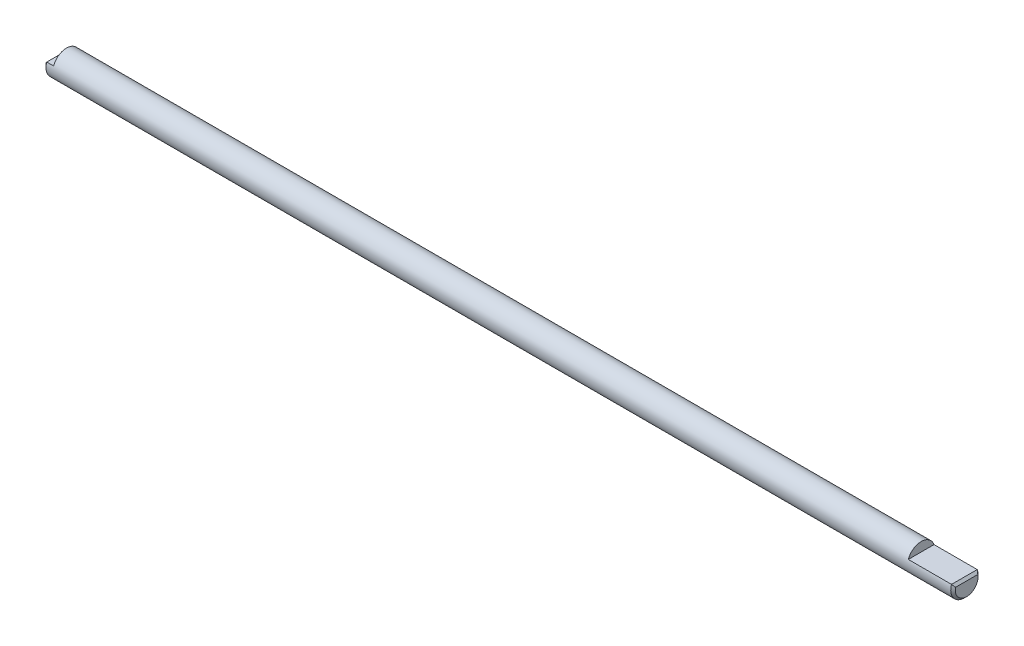
ISO-10303-21;
HEADER;
FILE_DESCRIPTION(('STEP AP214'),'2;1');
FILE_NAME('part.step','',(''),(''),'','','');
FILE_SCHEMA(('AUTOMOTIVE_DESIGN { 1 0 10303 214 1 1 1 1 }'));
ENDSEC;
DATA;
#1=APPLICATION_CONTEXT('core data for automotive mechanical design processes');
#2=APPLICATION_PROTOCOL_DEFINITION('international standard','automotive_design',2000,#1);
#3=PRODUCT_CONTEXT('',#1,'mechanical');
#4=PRODUCT('Part','Part','',(#3));
#5=PRODUCT_RELATED_PRODUCT_CATEGORY('part','',(#4));
#6=PRODUCT_DEFINITION_FORMATION('','',#4);
#7=PRODUCT_DEFINITION_CONTEXT('part definition',#1,'design');
#8=PRODUCT_DEFINITION('design','',#6,#7);
#9=PRODUCT_DEFINITION_SHAPE('','',#8);
#10=(LENGTH_UNIT() NAMED_UNIT(*) SI_UNIT(.MILLI.,.METRE.));
#11=(NAMED_UNIT(*) PLANE_ANGLE_UNIT() SI_UNIT($,.RADIAN.));
#12=(NAMED_UNIT(*) SI_UNIT($,.STERADIAN.) SOLID_ANGLE_UNIT());
#13=UNCERTAINTY_MEASURE_WITH_UNIT(LENGTH_MEASURE(1.E-05),#10,'distance_accuracy_value','');
#14=(GEOMETRIC_REPRESENTATION_CONTEXT(3) GLOBAL_UNCERTAINTY_ASSIGNED_CONTEXT((#13)) GLOBAL_UNIT_ASSIGNED_CONTEXT((#10,
#11,#12)) REPRESENTATION_CONTEXT('',''));
#15=CARTESIAN_POINT('',(0.,0.,0.));
#16=DIRECTION('',(0.,0.,1.));
#17=DIRECTION('',(1.,0.,0.));
#18=AXIS2_PLACEMENT_3D('',#15,#16,#17);
#19=CARTESIAN_POINT('',(0.,0.,0.));
#20=DIRECTION('',(1.,0.,0.));
#21=DIRECTION('',(0.,0.,-1.));
#22=AXIS2_PLACEMENT_3D('',#19,#20,#21);
#23=PLANE('',#22);
#24=CARTESIAN_POINT('',(0.,0.,0.));
#25=DIRECTION('',(1.,0.,0.));
#26=DIRECTION('',(0.,0.,-1.));
#27=AXIS2_PLACEMENT_3D('',#24,#25,#26);
#28=CIRCLE('',#27,2.50000000000006);
#29=CARTESIAN_POINT('',(0.,0.500000000000055,-2.44948974278323));
#30=VERTEX_POINT('',#29);
#31=CARTESIAN_POINT('',(0.,0.500000000000055,2.44948974278323));
#32=VERTEX_POINT('',#31);
#33=EDGE_CURVE('E114',#30,#32,#28,.F.);
#34=ORIENTED_EDGE('',*,*,#33,.T.);
#35=DIRECTION('',(0.,0.,-1.));
#36=VECTOR('',#35,1.);
#37=CARTESIAN_POINT('',(0.,0.500000000000055,0.));
#38=LINE('',#37,#36);
#39=EDGE_CURVE('E122',#32,#30,#38,.T.);
#40=ORIENTED_EDGE('',*,*,#39,.T.);
#41=EDGE_LOOP('',(#34,#40));
#42=FACE_BOUND('',#41,.T.);
#43=ADVANCED_FACE('F33',(#42),#23,.F.);
#44=CARTESIAN_POINT('',(0.,0.,0.));
#45=DIRECTION('',(-1.,0.,0.));
#46=DIRECTION('',(0.,0.,1.));
#47=AXIS2_PLACEMENT_3D('',#44,#45,#46);
#48=CYLINDRICAL_SURFACE('',#47,3.);
#49=DIRECTION('',(-1.,0.,0.));
#50=VECTOR('',#49,1.);
#51=CARTESIAN_POINT('',(0.,0.999999999999999,2.82842712474619));
#52=LINE('',#51,#50);
#53=CARTESIAN_POINT('',(2.,0.999999999999999,2.82842712474619));
#54=VERTEX_POINT('',#53);
#55=CARTESIAN_POINT('',(0.499999999999954,0.999999999999999,2.82842712474619));
#56=VERTEX_POINT('',#55);
#57=EDGE_CURVE('E111',#54,#56,#52,.T.);
#58=ORIENTED_EDGE('',*,*,#57,.T.);
#59=CARTESIAN_POINT('',(0.499999999999954,0.,0.));
#60=DIRECTION('',(1.,0.,0.));
#61=DIRECTION('',(0.,0.,-1.));
#62=AXIS2_PLACEMENT_3D('',#59,#60,#61);
#63=CIRCLE('',#62,3.);
#64=CARTESIAN_POINT('',(0.499999999999954,0.999999999999999,-2.82842712474619));
#65=VERTEX_POINT('',#64);
#66=EDGE_CURVE('E127',#56,#65,#63,.T.);
#67=ORIENTED_EDGE('',*,*,#66,.T.);
#68=DIRECTION('',(-1.,0.,0.));
#69=VECTOR('',#68,1.);
#70=CARTESIAN_POINT('',(0.,0.999999999999999,-2.82842712474619));
#71=LINE('',#70,#69);
#72=CARTESIAN_POINT('',(2.,0.999999999999999,-2.82842712474619));
#73=VERTEX_POINT('',#72);
#74=EDGE_CURVE('E161',#65,#73,#71,.F.);
#75=ORIENTED_EDGE('',*,*,#74,.T.);
#76=CARTESIAN_POINT('',(2.,0.,0.));
#77=DIRECTION('',(1.,0.,0.));
#78=DIRECTION('',(0.,1.,0.));
#79=AXIS2_PLACEMENT_3D('',#76,#77,#78);
#80=CIRCLE('',#79,3.);
#81=EDGE_CURVE('E117',#73,#54,#80,.T.);
#82=ORIENTED_EDGE('',*,*,#81,.T.);
#83=EDGE_LOOP('',(#58,#67,#75,#82));
#84=FACE_BOUND('',#83,.T.);
#85=DIRECTION('',(-1.,0.,0.));
#86=VECTOR('',#85,1.);
#87=CARTESIAN_POINT('',(0.,0.999999999999998,-2.82842712474619));
#88=LINE('',#87,#86);
#89=CARTESIAN_POINT('',(190.,0.999999999999998,-2.82842712474619));
#90=VERTEX_POINT('',#89);
#91=CARTESIAN_POINT('',(199.5,0.999999999999998,-2.82842712474619));
#92=VERTEX_POINT('',#91);
#93=EDGE_CURVE('E94',#90,#92,#88,.F.);
#94=ORIENTED_EDGE('',*,*,#93,.T.);
#95=CARTESIAN_POINT('',(199.5,0.,0.));
#96=DIRECTION('',(-1.,0.,0.));
#97=DIRECTION('',(0.,0.,1.));
#98=AXIS2_PLACEMENT_3D('',#95,#96,#97);
#99=CIRCLE('',#98,3.);
#100=CARTESIAN_POINT('',(199.5,0.999999999999998,2.82842712474619));
#101=VERTEX_POINT('',#100);
#102=EDGE_CURVE('E125',#92,#101,#99,.T.);
#103=ORIENTED_EDGE('',*,*,#102,.T.);
#104=DIRECTION('',(-1.,0.,0.));
#105=VECTOR('',#104,1.);
#106=CARTESIAN_POINT('',(0.,0.999999999999998,2.82842712474619));
#107=LINE('',#106,#105);
#108=CARTESIAN_POINT('',(190.,0.999999999999998,2.82842712474619));
#109=VERTEX_POINT('',#108);
#110=EDGE_CURVE('E101',#101,#109,#107,.T.);
#111=ORIENTED_EDGE('',*,*,#110,.T.);
#112=CARTESIAN_POINT('',(190.,0.,0.));
#113=DIRECTION('',(-1.,0.,0.));
#114=DIRECTION('',(0.,0.,1.));
#115=AXIS2_PLACEMENT_3D('',#112,#113,#114);
#116=CIRCLE('',#115,3.);
#117=EDGE_CURVE('E106',#109,#90,#116,.T.);
#118=ORIENTED_EDGE('',*,*,#117,.T.);
#119=EDGE_LOOP('',(#94,#103,#111,#118));
#120=FACE_BOUND('',#119,.T.);
#121=ADVANCED_FACE('F109',(#84,#120),#48,.T.);
#122=CARTESIAN_POINT('',(200.,0.,0.));
#123=DIRECTION('',(-1.,0.,0.));
#124=DIRECTION('',(0.,0.,1.));
#125=AXIS2_PLACEMENT_3D('',#122,#123,#124);
#126=PLANE('',#125);
#127=CARTESIAN_POINT('',(200.,0.,0.));
#128=DIRECTION('',(-1.,0.,0.));
#129=DIRECTION('',(0.,0.,1.));
#130=AXIS2_PLACEMENT_3D('',#127,#128,#129);
#131=CIRCLE('',#130,2.5);
#132=CARTESIAN_POINT('',(200.,0.499999999999999,2.44948974278318));
#133=VERTEX_POINT('',#132);
#134=CARTESIAN_POINT('',(200.,0.499999999999999,-2.44948974278318));
#135=VERTEX_POINT('',#134);
#136=EDGE_CURVE('E53',#133,#135,#131,.F.);
#137=ORIENTED_EDGE('',*,*,#136,.T.);
#138=DIRECTION('',(0.,0.,1.));
#139=VECTOR('',#138,1.);
#140=CARTESIAN_POINT('',(200.,0.499999999999999,0.));
#141=LINE('',#140,#139);
#142=EDGE_CURVE('E46',#135,#133,#141,.T.);
#143=ORIENTED_EDGE('',*,*,#142,.T.);
#144=EDGE_LOOP('',(#137,#143));
#145=FACE_BOUND('',#144,.T.);
#146=ADVANCED_FACE('F175',(#145),#126,.F.);
#147=CARTESIAN_POINT('',(2.,3.,-3.));
#148=DIRECTION('',(1.,0.,0.));
#149=DIRECTION('',(0.,1.,0.));
#150=AXIS2_PLACEMENT_3D('',#147,#148,#149);
#151=PLANE('',#150);
#152=ORIENTED_EDGE('',*,*,#81,.F.);
#153=DIRECTION('',(0.,0.,1.));
#154=VECTOR('',#153,1.);
#155=CARTESIAN_POINT('',(2.,0.999999999999999,-3.));
#156=LINE('',#155,#154);
#157=EDGE_CURVE('E158',#73,#54,#156,.T.);
#158=ORIENTED_EDGE('',*,*,#157,.T.);
#159=EDGE_LOOP('',(#152,#158));
#160=FACE_BOUND('',#159,.T.);
#161=ADVANCED_FACE('F173',(#160),#151,.F.);
#162=CARTESIAN_POINT('',(0.,0.999999999999999,-3.));
#163=DIRECTION('',(0.,-1.,0.));
#164=DIRECTION('',(0.,0.,-1.));
#165=AXIS2_PLACEMENT_3D('',#162,#163,#164);
#166=PLANE('',#165);
#167=ORIENTED_EDGE('',*,*,#74,.F.);
#168=DIRECTION('',(0.,0.,1.));
#169=VECTOR('',#168,1.);
#170=CARTESIAN_POINT('',(0.499999999999954,0.999999999999999,-3.));
#171=LINE('',#170,#169);
#172=EDGE_CURVE('E110',#65,#56,#171,.T.);
#173=ORIENTED_EDGE('',*,*,#172,.T.);
#174=ORIENTED_EDGE('',*,*,#57,.F.);
#175=ORIENTED_EDGE('',*,*,#157,.F.);
#176=EDGE_LOOP('',(#167,#173,#174,#175));
#177=FACE_BOUND('',#176,.T.);
#178=ADVANCED_FACE('F171',(#177),#166,.F.);
#179=CARTESIAN_POINT('',(190.,3.,-3.));
#180=DIRECTION('',(-1.,0.,0.));
#181=DIRECTION('',(0.,0.,1.));
#182=AXIS2_PLACEMENT_3D('',#179,#180,#181);
#183=PLANE('',#182);
#184=DIRECTION('',(0.,0.,1.));
#185=VECTOR('',#184,1.);
#186=CARTESIAN_POINT('',(190.,0.999999999999998,-3.));
#187=LINE('',#186,#185);
#188=EDGE_CURVE('E98',#90,#109,#187,.T.);
#189=ORIENTED_EDGE('',*,*,#188,.F.);
#190=ORIENTED_EDGE('',*,*,#117,.F.);
#191=EDGE_LOOP('',(#189,#190));
#192=FACE_BOUND('',#191,.T.);
#193=ADVANCED_FACE('F105',(#192),#183,.F.);
#194=CARTESIAN_POINT('',(190.,0.999999999999998,-3.));
#195=DIRECTION('',(0.,-1.,0.));
#196=DIRECTION('',(0.,0.,-1.));
#197=AXIS2_PLACEMENT_3D('',#194,#195,#196);
#198=PLANE('',#197);
#199=ORIENTED_EDGE('',*,*,#110,.F.);
#200=DIRECTION('',(0.,0.,-1.));
#201=VECTOR('',#200,1.);
#202=CARTESIAN_POINT('',(199.5,0.999999999999998,-3.));
#203=LINE('',#202,#201);
#204=EDGE_CURVE('E11',#101,#92,#203,.T.);
#205=ORIENTED_EDGE('',*,*,#204,.T.);
#206=ORIENTED_EDGE('',*,*,#93,.F.);
#207=ORIENTED_EDGE('',*,*,#188,.T.);
#208=EDGE_LOOP('',(#199,#205,#206,#207));
#209=FACE_BOUND('',#208,.T.);
#210=ADVANCED_FACE('F97',(#209),#198,.F.);
#211=CARTESIAN_POINT('',(0.,0.,0.));
#212=DIRECTION('',(1.,0.,0.));
#213=DIRECTION('',(0.,0.,-1.));
#214=AXIS2_PLACEMENT_3D('',#211,#212,#213);
#215=CONICAL_SURFACE('',#214,2.50000000000006,0.785398163397438);
#216=CARTESIAN_POINT('',(0.499999999999954,0.999999999999999,2.82842712474619));
#217=CARTESIAN_POINT('',(0.457709001378929,0.957709001378974,2.79852126612994));
#218=CARTESIAN_POINT('',(0.415550608917753,0.915550608917799,2.7682380972948));
#219=CARTESIAN_POINT('',(0.33154118660304,0.831541186603088,2.70686321526973));
#220=CARTESIAN_POINT('',(0.289690090263275,0.789690090263324,2.67577168400755));
#221=CARTESIAN_POINT('',(0.206316425358126,0.706316425358177,2.6127112860903));
#222=CARTESIAN_POINT('',(0.164793873306471,0.664793873306522,2.58074237569162));
#223=CARTESIAN_POINT('',(0.0821118096916123,0.582111809691666,2.51584917968175));
#224=CARTESIAN_POINT('',(0.0409523812714221,0.540952381271476,2.48292468231544));
#225=CARTESIAN_POINT('',(0.,0.500000000000055,2.44948974278323));
#226=B_SPLINE_CURVE_WITH_KNOTS('',3,(#216,#217,#218,#219,#220,#221,#222,#223,#224,#225),
.UNSPECIFIED.,.F.,.F.,(4,2,2,2,4),(0.,0.200606095756172,0.401167427946396,0.601738777781366,
0.802354918161704),.UNSPECIFIED.);
#227=EDGE_CURVE('E131',#32,#56,#226,.F.);
#228=ORIENTED_EDGE('',*,*,#227,.F.);
#229=ORIENTED_EDGE('',*,*,#33,.F.);
#230=CARTESIAN_POINT('',(0.,0.500000000000055,-2.44948974278323));
#231=CARTESIAN_POINT('',(0.0409523812714218,0.540952381271476,-2.48292468231544));
#232=CARTESIAN_POINT('',(0.082111809691612,0.582111809691665,-2.51584917968175));
#233=CARTESIAN_POINT('',(0.16479387330647,0.664793873306522,-2.58074237569162));
#234=CARTESIAN_POINT('',(0.206316425358126,0.706316425358177,-2.6127112860903));
#235=CARTESIAN_POINT('',(0.289690090263274,0.789690090263323,-2.67577168400755));
#236=CARTESIAN_POINT('',(0.331541186603039,0.831541186603088,-2.70686321526973));
#237=CARTESIAN_POINT('',(0.415550608917753,0.915550608917799,-2.7682380972948));
#238=CARTESIAN_POINT('',(0.457709001378928,0.957709001378974,-2.79852126612994));
#239=CARTESIAN_POINT('',(0.499999999999954,0.999999999999999,-2.82842712474619));
#240=B_SPLINE_CURVE_WITH_KNOTS('',3,(#230,#231,#232,#233,#234,#235,#236,#237,#238,#239),
.UNSPECIFIED.,.F.,.F.,(4,2,2,2,4),(0.,0.200616140380338,0.401187490215308,0.601748822405531,
0.802354918161704),.UNSPECIFIED.);
#241=EDGE_CURVE('E107',#65,#30,#240,.F.);
#242=ORIENTED_EDGE('',*,*,#241,.F.);
#243=ORIENTED_EDGE('',*,*,#66,.F.);
#244=EDGE_LOOP('',(#228,#229,#242,#243));
#245=FACE_BOUND('',#244,.T.);
#246=ADVANCED_FACE('F141',(#245),#215,.T.);
#247=CARTESIAN_POINT('',(0.499999999999954,0.999999999999999,-3.));
#248=DIRECTION('',(0.70710678118654,-0.707106781186555,0.));
#249=DIRECTION('',(0.,0.,1.));
#250=AXIS2_PLACEMENT_3D('',#247,#248,#249);
#251=PLANE('',#250);
#252=ORIENTED_EDGE('',*,*,#241,.T.);
#253=ORIENTED_EDGE('',*,*,#39,.F.);
#254=ORIENTED_EDGE('',*,*,#227,.T.);
#255=ORIENTED_EDGE('',*,*,#172,.F.);
#256=EDGE_LOOP('',(#252,#253,#254,#255));
#257=FACE_BOUND('',#256,.T.);
#258=ADVANCED_FACE('F144',(#257),#251,.F.);
#259=CARTESIAN_POINT('',(199.5,0.,0.));
#260=DIRECTION('',(-1.,0.,0.));
#261=DIRECTION('',(0.,0.,1.));
#262=AXIS2_PLACEMENT_3D('',#259,#260,#261);
#263=CONICAL_SURFACE('',#262,3.,0.785398163397447);
#264=CARTESIAN_POINT('',(200.,0.499999999999999,2.44948974278318));
#265=CARTESIAN_POINT('',(199.959047618729,0.540952381271432,2.4829246823154));
#266=CARTESIAN_POINT('',(199.917888190308,0.582111809691626,2.51584917968172));
#267=CARTESIAN_POINT('',(199.835206126694,0.664793873306488,2.58074237569159));
#268=CARTESIAN_POINT('',(199.793683574642,0.706316425358144,2.61271128609028));
#269=CARTESIAN_POINT('',(199.710309909737,0.789690090263299,2.67577168400753));
#270=CARTESIAN_POINT('',(199.668458813397,0.83154118660307,2.70686321526972));
#271=CARTESIAN_POINT('',(199.584449391082,0.915550608917792,2.7682380972948));
#272=CARTESIAN_POINT('',(199.542290998621,0.95770900137897,2.79852126612994));
#273=CARTESIAN_POINT('',(199.5,0.999999999999989,2.82842712474619));
#274=B_SPLINE_CURVE_WITH_KNOTS('',3,(#264,#265,#266,#267,#268,#269,#270,#271,#272,#273),
.UNSPECIFIED.,.F.,.F.,(4,2,2,2,4),(0.,0.200616140380365,0.40118749021536,0.601748822405594,
0.80235491816178),.UNSPECIFIED.);
#275=EDGE_CURVE('E61',#101,#133,#274,.F.);
#276=ORIENTED_EDGE('',*,*,#275,.F.);
#277=ORIENTED_EDGE('',*,*,#102,.F.);
#278=CARTESIAN_POINT('',(199.5,0.999999999999998,-2.82842712474619));
#279=CARTESIAN_POINT('',(199.542290998621,0.957709001378976,-2.79852126612994));
#280=CARTESIAN_POINT('',(199.584449391082,0.915550608917796,-2.7682380972948));
#281=CARTESIAN_POINT('',(199.668458813397,0.831541186603072,-2.70686321526972));
#282=CARTESIAN_POINT('',(199.710309909737,0.7896900902633,-2.67577168400753));
#283=CARTESIAN_POINT('',(199.793683574642,0.706316425358144,-2.61271128609028));
#284=CARTESIAN_POINT('',(199.835206126694,0.664793873306488,-2.58074237569159));
#285=CARTESIAN_POINT('',(199.917888190308,0.582111809691624,-2.51584917968172));
#286=CARTESIAN_POINT('',(199.959047618729,0.54095238127143,-2.4829246823154));
#287=CARTESIAN_POINT('',(200.,0.499999999999995,-2.44948974278318));
#288=B_SPLINE_CURVE_WITH_KNOTS('',3,(#278,#279,#280,#281,#282,#283,#284,#285,#286,#287),
.UNSPECIFIED.,.F.,.F.,(4,2,2,2,4),(0.,0.200606095756193,0.401167427946429,0.601738777781425,
0.802354918161793),.UNSPECIFIED.);
#289=EDGE_CURVE('E38',#135,#92,#288,.F.);
#290=ORIENTED_EDGE('',*,*,#289,.F.);
#291=ORIENTED_EDGE('',*,*,#136,.F.);
#292=EDGE_LOOP('',(#276,#277,#290,#291));
#293=FACE_BOUND('',#292,.T.);
#294=ADVANCED_FACE('F147',(#293),#263,.T.);
#295=CARTESIAN_POINT('',(200.,0.499999999999999,0.));
#296=DIRECTION('',(-0.707106781186547,-0.707106781186548,0.));
#297=DIRECTION('',(0.,0.,1.));
#298=AXIS2_PLACEMENT_3D('',#295,#296,#297);
#299=PLANE('',#298);
#300=ORIENTED_EDGE('',*,*,#289,.T.);
#301=ORIENTED_EDGE('',*,*,#204,.F.);
#302=ORIENTED_EDGE('',*,*,#275,.T.);
#303=ORIENTED_EDGE('',*,*,#142,.F.);
#304=EDGE_LOOP('',(#300,#301,#302,#303));
#305=FACE_BOUND('',#304,.T.);
#306=ADVANCED_FACE('F35',(#305),#299,.F.);
#307=CLOSED_SHELL('',(#43,#121,#146,#161,#178,#193,#210,#246,#258,#294,#306));
#308=MANIFOLD_SOLID_BREP('B2',#307);
#309=ADVANCED_BREP_SHAPE_REPRESENTATION('',(#18,#308),#14);
#310=SHAPE_DEFINITION_REPRESENTATION(#9,#309);
ENDSEC;
END-ISO-10303-21;
